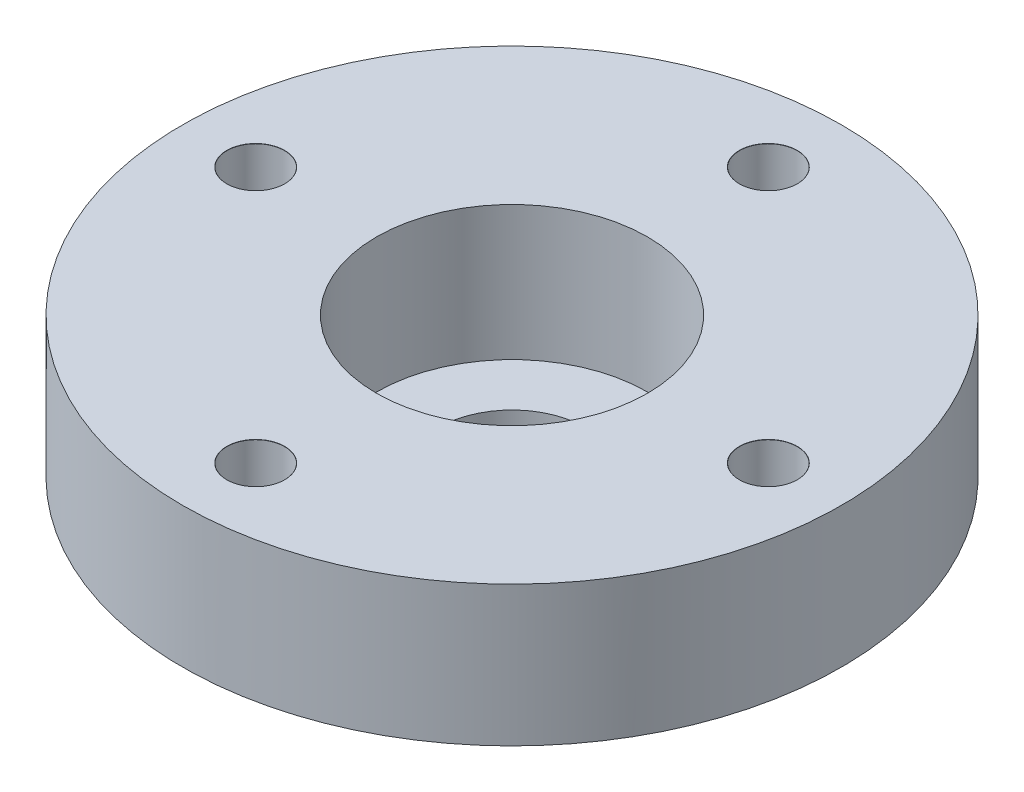
ISO-10303-21;
HEADER;
FILE_DESCRIPTION(('STEP AP214'),'2;1');
FILE_NAME('part.step','',(''),(''),'','','');
FILE_SCHEMA(('AUTOMOTIVE_DESIGN { 1 0 10303 214 1 1 1 1 }'));
ENDSEC;
DATA;
#1=APPLICATION_CONTEXT('core data for automotive mechanical design processes');
#2=APPLICATION_PROTOCOL_DEFINITION('international standard','automotive_design',2000,#1);
#3=PRODUCT_CONTEXT('',#1,'mechanical');
#4=PRODUCT('Part','Part','',(#3));
#5=PRODUCT_RELATED_PRODUCT_CATEGORY('part','',(#4));
#6=PRODUCT_DEFINITION_FORMATION('','',#4);
#7=PRODUCT_DEFINITION_CONTEXT('part definition',#1,'design');
#8=PRODUCT_DEFINITION('design','',#6,#7);
#9=PRODUCT_DEFINITION_SHAPE('','',#8);
#10=(LENGTH_UNIT() NAMED_UNIT(*) SI_UNIT(.MILLI.,.METRE.));
#11=(NAMED_UNIT(*) PLANE_ANGLE_UNIT() SI_UNIT($,.RADIAN.));
#12=(NAMED_UNIT(*) SI_UNIT($,.STERADIAN.) SOLID_ANGLE_UNIT());
#13=UNCERTAINTY_MEASURE_WITH_UNIT(LENGTH_MEASURE(1.E-05),#10,'distance_accuracy_value','');
#14=(GEOMETRIC_REPRESENTATION_CONTEXT(3) GLOBAL_UNCERTAINTY_ASSIGNED_CONTEXT((#13)) GLOBAL_UNIT_ASSIGNED_CONTEXT((#10,
#11,#12)) REPRESENTATION_CONTEXT('',''));
#15=CARTESIAN_POINT('',(0.,0.,0.));
#16=DIRECTION('',(0.,0.,1.));
#17=DIRECTION('',(1.,0.,0.));
#18=AXIS2_PLACEMENT_3D('',#15,#16,#17);
#19=CARTESIAN_POINT('',(0.,-4.,0.));
#20=DIRECTION('',(0.,-1.,0.));
#21=DIRECTION('',(0.,0.,-1.));
#22=AXIS2_PLACEMENT_3D('',#19,#20,#21);
#23=PLANE('',#22);
#24=CARTESIAN_POINT('',(-44.45,-4.,0.));
#25=DIRECTION('',(0.,1.,0.));
#26=DIRECTION('',(0.,0.,1.));
#27=AXIS2_PLACEMENT_3D('',#24,#25,#26);
#28=CIRCLE('',#27,5.025);
#29=CARTESIAN_POINT('',(-44.45,-4.,5.025));
#30=VERTEX_POINT('',#29);
#31=EDGE_CURVE('E112',#30,#30,#28,.T.);
#32=ORIENTED_EDGE('',*,*,#31,.T.);
#33=EDGE_LOOP('',(#32));
#34=FACE_BOUND('',#33,.T.);
#35=CARTESIAN_POINT('',(0.,-4.,44.45));
#36=DIRECTION('',(0.,1.,0.));
#37=DIRECTION('',(0.,0.,1.));
#38=AXIS2_PLACEMENT_3D('',#35,#36,#37);
#39=CIRCLE('',#38,5.025);
#40=CARTESIAN_POINT('',(0.,-4.,49.475));
#41=VERTEX_POINT('',#40);
#42=EDGE_CURVE('E100',#41,#41,#39,.T.);
#43=ORIENTED_EDGE('',*,*,#42,.T.);
#44=EDGE_LOOP('',(#43));
#45=FACE_BOUND('',#44,.T.);
#46=CARTESIAN_POINT('',(0.,-4.,-44.45));
#47=DIRECTION('',(0.,1.,0.));
#48=DIRECTION('',(0.,0.,1.));
#49=AXIS2_PLACEMENT_3D('',#46,#47,#48);
#50=CIRCLE('',#49,5.025);
#51=CARTESIAN_POINT('',(0.,-4.,-39.425));
#52=VERTEX_POINT('',#51);
#53=EDGE_CURVE('E88',#52,#52,#50,.T.);
#54=ORIENTED_EDGE('',*,*,#53,.T.);
#55=EDGE_LOOP('',(#54));
#56=FACE_BOUND('',#55,.T.);
#57=CARTESIAN_POINT('',(44.45,-4.,0.));
#58=DIRECTION('',(0.,1.,0.));
#59=DIRECTION('',(0.,0.,1.));
#60=AXIS2_PLACEMENT_3D('',#57,#58,#59);
#61=CIRCLE('',#60,5.025);
#62=CARTESIAN_POINT('',(44.45,-4.,5.025));
#63=VERTEX_POINT('',#62);
#64=EDGE_CURVE('E76',#63,#63,#61,.T.);
#65=ORIENTED_EDGE('',*,*,#64,.T.);
#66=EDGE_LOOP('',(#65));
#67=FACE_BOUND('',#66,.T.);
#68=CARTESIAN_POINT('',(0.,-4.,0.));
#69=DIRECTION('',(0.,-1.,0.));
#70=DIRECTION('',(0.,0.,-1.));
#71=AXIS2_PLACEMENT_3D('',#68,#69,#70);
#72=CIRCLE('',#71,57.15);
#73=CARTESIAN_POINT('',(0.,-4.,-57.15));
#74=VERTEX_POINT('',#73);
#75=EDGE_CURVE('E42',#74,#74,#72,.T.);
#76=ORIENTED_EDGE('',*,*,#75,.T.);
#77=EDGE_LOOP('',(#76));
#78=FACE_BOUND('',#77,.T.);
#79=CARTESIAN_POINT('',(0.,-4.,0.));
#80=DIRECTION('',(0.,-1.,0.));
#81=DIRECTION('',(0.,0.,-1.));
#82=AXIS2_PLACEMENT_3D('',#79,#80,#81);
#83=CIRCLE('',#82,15.);
#84=CARTESIAN_POINT('',(0.,-4.,-15.));
#85=VERTEX_POINT('',#84);
#86=EDGE_CURVE('E53',#85,#85,#83,.T.);
#87=ORIENTED_EDGE('',*,*,#86,.F.);
#88=EDGE_LOOP('',(#87));
#89=FACE_BOUND('',#88,.T.);
#90=ADVANCED_FACE('F35',(#34,#45,#56,#67,#78,#89),#23,.T.);
#91=CARTESIAN_POINT('',(0.,175.644610179245,0.));
#92=DIRECTION('',(0.,-1.,0.));
#93=DIRECTION('',(0.,0.,-1.));
#94=AXIS2_PLACEMENT_3D('',#91,#92,#93);
#95=CYLINDRICAL_SURFACE('',#94,57.15);
#96=ORIENTED_EDGE('',*,*,#75,.F.);
#97=EDGE_LOOP('',(#96));
#98=FACE_BOUND('',#97,.T.);
#99=CARTESIAN_POINT('',(0.,20.3,0.));
#100=DIRECTION('',(0.,1.,0.));
#101=DIRECTION('',(0.,0.,1.));
#102=AXIS2_PLACEMENT_3D('',#99,#100,#101);
#103=CIRCLE('',#102,57.15);
#104=CARTESIAN_POINT('',(0.,20.3,57.15));
#105=VERTEX_POINT('',#104);
#106=EDGE_CURVE('E61',#105,#105,#103,.T.);
#107=ORIENTED_EDGE('',*,*,#106,.F.);
#108=EDGE_LOOP('',(#107));
#109=FACE_BOUND('',#108,.T.);
#110=ADVANCED_FACE('F37',(#98,#109),#95,.T.);
#111=CARTESIAN_POINT('',(0.,80.4680374315355,0.));
#112=DIRECTION('',(0.,-1.,0.));
#113=DIRECTION('',(0.,0.,-1.));
#114=AXIS2_PLACEMENT_3D('',#111,#112,#113);
#115=CYLINDRICAL_SURFACE('',#114,23.5);
#116=CARTESIAN_POINT('',(0.,-3.,0.));
#117=DIRECTION('',(0.,-1.,0.));
#118=DIRECTION('',(0.,0.,-1.));
#119=AXIS2_PLACEMENT_3D('',#116,#117,#118);
#120=CIRCLE('',#119,23.5);
#121=CARTESIAN_POINT('',(0.,-3.,-23.5));
#122=VERTEX_POINT('',#121);
#123=EDGE_CURVE('E10',#122,#122,#120,.F.);
#124=ORIENTED_EDGE('',*,*,#123,.F.);
#125=EDGE_LOOP('',(#124));
#126=FACE_BOUND('',#125,.T.);
#127=CARTESIAN_POINT('',(0.,20.3,0.));
#128=DIRECTION('',(0.,1.,0.));
#129=DIRECTION('',(0.,0.,1.));
#130=AXIS2_PLACEMENT_3D('',#127,#128,#129);
#131=CIRCLE('',#130,23.5);
#132=CARTESIAN_POINT('',(0.,20.3,23.5));
#133=VERTEX_POINT('',#132);
#134=EDGE_CURVE('E64',#133,#133,#131,.T.);
#135=ORIENTED_EDGE('',*,*,#134,.T.);
#136=EDGE_LOOP('',(#135));
#137=FACE_BOUND('',#136,.T.);
#138=ADVANCED_FACE('F153',(#126,#137),#115,.F.);
#139=CARTESIAN_POINT('',(0.,-3.,0.));
#140=DIRECTION('',(0.,-1.,0.));
#141=DIRECTION('',(0.,0.,-1.));
#142=AXIS2_PLACEMENT_3D('',#139,#140,#141);
#143=PLANE('',#142);
#144=CARTESIAN_POINT('',(0.,-3.,0.));
#145=DIRECTION('',(0.,-1.,0.));
#146=DIRECTION('',(0.,0.,-1.));
#147=AXIS2_PLACEMENT_3D('',#144,#145,#146);
#148=CIRCLE('',#147,12.8);
#149=CARTESIAN_POINT('',(0.,-3.,-12.8));
#150=VERTEX_POINT('',#149);
#151=EDGE_CURVE('E46',#150,#150,#148,.T.);
#152=ORIENTED_EDGE('',*,*,#151,.T.);
#153=EDGE_LOOP('',(#152));
#154=FACE_BOUND('',#153,.T.);
#155=ORIENTED_EDGE('',*,*,#123,.T.);
#156=EDGE_LOOP('',(#155));
#157=FACE_BOUND('',#156,.T.);
#158=ADVANCED_FACE('F155',(#154,#157),#143,.F.);
#159=CARTESIAN_POINT('',(0.,-4.,0.));
#160=DIRECTION('',(0.,1.,0.));
#161=DIRECTION('',(0.,0.,1.));
#162=AXIS2_PLACEMENT_3D('',#159,#160,#161);
#163=CYLINDRICAL_SURFACE('',#162,12.8);
#164=ORIENTED_EDGE('',*,*,#151,.F.);
#165=EDGE_LOOP('',(#164));
#166=FACE_BOUND('',#165,.T.);
#167=CARTESIAN_POINT('',(0.,-6.,0.));
#168=DIRECTION('',(0.,-1.,0.));
#169=DIRECTION('',(0.,0.,-1.));
#170=AXIS2_PLACEMENT_3D('',#167,#168,#169);
#171=CIRCLE('',#170,12.8);
#172=CARTESIAN_POINT('',(0.,-6.,-12.8));
#173=VERTEX_POINT('',#172);
#174=EDGE_CURVE('E56',#173,#173,#171,.T.);
#175=ORIENTED_EDGE('',*,*,#174,.T.);
#176=EDGE_LOOP('',(#175));
#177=FACE_BOUND('',#176,.T.);
#178=ADVANCED_FACE('F161',(#166,#177),#163,.F.);
#179=CARTESIAN_POINT('',(0.,-6.,0.));
#180=DIRECTION('',(0.,-1.,0.));
#181=DIRECTION('',(0.,0.,-1.));
#182=AXIS2_PLACEMENT_3D('',#179,#180,#181);
#183=PLANE('',#182);
#184=CARTESIAN_POINT('',(0.,-6.,0.));
#185=DIRECTION('',(0.,-1.,0.));
#186=DIRECTION('',(0.,0.,-1.));
#187=AXIS2_PLACEMENT_3D('',#184,#185,#186);
#188=CIRCLE('',#187,15.);
#189=CARTESIAN_POINT('',(0.,-6.,-15.));
#190=VERTEX_POINT('',#189);
#191=EDGE_CURVE('E50',#190,#190,#188,.T.);
#192=ORIENTED_EDGE('',*,*,#191,.T.);
#193=EDGE_LOOP('',(#192));
#194=FACE_BOUND('',#193,.T.);
#195=ORIENTED_EDGE('',*,*,#174,.F.);
#196=EDGE_LOOP('',(#195));
#197=FACE_BOUND('',#196,.T.);
#198=ADVANCED_FACE('F172',(#194,#197),#183,.T.);
#199=CARTESIAN_POINT('',(0.,-6.,0.));
#200=DIRECTION('',(0.,1.,0.));
#201=DIRECTION('',(0.,0.,1.));
#202=AXIS2_PLACEMENT_3D('',#199,#200,#201);
#203=CYLINDRICAL_SURFACE('',#202,15.);
#204=ORIENTED_EDGE('',*,*,#191,.F.);
#205=EDGE_LOOP('',(#204));
#206=FACE_BOUND('',#205,.T.);
#207=ORIENTED_EDGE('',*,*,#86,.T.);
#208=EDGE_LOOP('',(#207));
#209=FACE_BOUND('',#208,.T.);
#210=ADVANCED_FACE('F141',(#206,#209),#203,.T.);
#211=CARTESIAN_POINT('',(0.,20.3,0.));
#212=DIRECTION('',(0.,1.,0.));
#213=DIRECTION('',(0.,0.,1.));
#214=AXIS2_PLACEMENT_3D('',#211,#212,#213);
#215=PLANE('',#214);
#216=CARTESIAN_POINT('',(-44.45,20.3,0.));
#217=DIRECTION('',(0.,1.,0.));
#218=DIRECTION('',(0.,0.,1.));
#219=AXIS2_PLACEMENT_3D('',#216,#217,#218);
#220=CIRCLE('',#219,5.025);
#221=CARTESIAN_POINT('',(-44.45,20.3,5.025));
#222=VERTEX_POINT('',#221);
#223=EDGE_CURVE('E109',#222,#222,#220,.T.);
#224=ORIENTED_EDGE('',*,*,#223,.F.);
#225=EDGE_LOOP('',(#224));
#226=FACE_BOUND('',#225,.T.);
#227=CARTESIAN_POINT('',(0.,20.3,44.45));
#228=DIRECTION('',(0.,1.,0.));
#229=DIRECTION('',(0.,0.,1.));
#230=AXIS2_PLACEMENT_3D('',#227,#228,#229);
#231=CIRCLE('',#230,5.025);
#232=CARTESIAN_POINT('',(0.,20.3,49.475));
#233=VERTEX_POINT('',#232);
#234=EDGE_CURVE('E97',#233,#233,#231,.T.);
#235=ORIENTED_EDGE('',*,*,#234,.F.);
#236=EDGE_LOOP('',(#235));
#237=FACE_BOUND('',#236,.T.);
#238=CARTESIAN_POINT('',(0.,20.3,-44.45));
#239=DIRECTION('',(0.,1.,0.));
#240=DIRECTION('',(0.,0.,1.));
#241=AXIS2_PLACEMENT_3D('',#238,#239,#240);
#242=CIRCLE('',#241,5.025);
#243=CARTESIAN_POINT('',(0.,20.3,-39.425));
#244=VERTEX_POINT('',#243);
#245=EDGE_CURVE('E85',#244,#244,#242,.T.);
#246=ORIENTED_EDGE('',*,*,#245,.F.);
#247=EDGE_LOOP('',(#246));
#248=FACE_BOUND('',#247,.T.);
#249=CARTESIAN_POINT('',(44.45,20.3,0.));
#250=DIRECTION('',(0.,1.,0.));
#251=DIRECTION('',(0.,0.,1.));
#252=AXIS2_PLACEMENT_3D('',#249,#250,#251);
#253=CIRCLE('',#252,5.025);
#254=CARTESIAN_POINT('',(44.45,20.3,5.025));
#255=VERTEX_POINT('',#254);
#256=EDGE_CURVE('E73',#255,#255,#253,.T.);
#257=ORIENTED_EDGE('',*,*,#256,.F.);
#258=EDGE_LOOP('',(#257));
#259=FACE_BOUND('',#258,.T.);
#260=ORIENTED_EDGE('',*,*,#106,.T.);
#261=EDGE_LOOP('',(#260));
#262=FACE_BOUND('',#261,.T.);
#263=ORIENTED_EDGE('',*,*,#134,.F.);
#264=EDGE_LOOP('',(#263));
#265=FACE_BOUND('',#264,.T.);
#266=ADVANCED_FACE('F137',(#226,#237,#248,#259,#262,#265),#215,.T.);
#267=CARTESIAN_POINT('',(44.45,-3.975,0.));
#268=DIRECTION('',(0.,-1.,0.));
#269=DIRECTION('',(0.,0.,-1.));
#270=AXIS2_PLACEMENT_3D('',#267,#268,#269);
#271=CONICAL_SURFACE('',#270,5.,0.785398163397309);
#272=ORIENTED_EDGE('',*,*,#64,.F.);
#273=EDGE_LOOP('',(#272));
#274=FACE_BOUND('',#273,.T.);
#275=CARTESIAN_POINT('',(44.45,-3.975,0.));
#276=DIRECTION('',(0.,1.,0.));
#277=DIRECTION('',(0.,0.,1.));
#278=AXIS2_PLACEMENT_3D('',#275,#276,#277);
#279=CIRCLE('',#278,5.);
#280=CARTESIAN_POINT('',(44.45,-3.975,5.));
#281=VERTEX_POINT('',#280);
#282=EDGE_CURVE('E67',#281,#281,#279,.T.);
#283=ORIENTED_EDGE('',*,*,#282,.T.);
#284=EDGE_LOOP('',(#283));
#285=FACE_BOUND('',#284,.T.);
#286=ADVANCED_FACE('F140',(#274,#285),#271,.F.);
#287=CARTESIAN_POINT('',(44.45,20.3,0.));
#288=DIRECTION('',(0.,1.,0.));
#289=DIRECTION('',(0.,0.,1.));
#290=AXIS2_PLACEMENT_3D('',#287,#288,#289);
#291=CYLINDRICAL_SURFACE('',#290,5.);
#292=ORIENTED_EDGE('',*,*,#282,.F.);
#293=EDGE_LOOP('',(#292));
#294=FACE_BOUND('',#293,.T.);
#295=CARTESIAN_POINT('',(44.45,20.275,0.));
#296=DIRECTION('',(0.,1.,0.));
#297=DIRECTION('',(0.,0.,1.));
#298=AXIS2_PLACEMENT_3D('',#295,#296,#297);
#299=CIRCLE('',#298,5.);
#300=CARTESIAN_POINT('',(44.45,20.275,5.));
#301=VERTEX_POINT('',#300);
#302=EDGE_CURVE('E70',#301,#301,#299,.T.);
#303=ORIENTED_EDGE('',*,*,#302,.T.);
#304=EDGE_LOOP('',(#303));
#305=FACE_BOUND('',#304,.T.);
#306=ADVANCED_FACE('F182',(#294,#305),#291,.F.);
#307=CARTESIAN_POINT('',(44.45,20.3,0.));
#308=DIRECTION('',(0.,1.,0.));
#309=DIRECTION('',(0.,0.,1.));
#310=AXIS2_PLACEMENT_3D('',#307,#308,#309);
#311=CONICAL_SURFACE('',#310,5.025,0.785398163397379);
#312=ORIENTED_EDGE('',*,*,#302,.F.);
#313=EDGE_LOOP('',(#312));
#314=FACE_BOUND('',#313,.T.);
#315=ORIENTED_EDGE('',*,*,#256,.T.);
#316=EDGE_LOOP('',(#315));
#317=FACE_BOUND('',#316,.T.);
#318=ADVANCED_FACE('F186',(#314,#317),#311,.F.);
#319=CARTESIAN_POINT('',(0.,-3.975,-44.45));
#320=DIRECTION('',(0.,-1.,0.));
#321=DIRECTION('',(0.,0.,-1.));
#322=AXIS2_PLACEMENT_3D('',#319,#320,#321);
#323=CONICAL_SURFACE('',#322,4.99999999999999,0.785398163397362);
#324=ORIENTED_EDGE('',*,*,#53,.F.);
#325=EDGE_LOOP('',(#324));
#326=FACE_BOUND('',#325,.T.);
#327=CARTESIAN_POINT('',(0.,-3.975,-44.45));
#328=DIRECTION('',(0.,1.,0.));
#329=DIRECTION('',(0.,0.,1.));
#330=AXIS2_PLACEMENT_3D('',#327,#328,#329);
#331=CIRCLE('',#330,4.99999999999999);
#332=CARTESIAN_POINT('',(0.,-3.975,-39.45));
#333=VERTEX_POINT('',#332);
#334=EDGE_CURVE('E79',#333,#333,#331,.T.);
#335=ORIENTED_EDGE('',*,*,#334,.T.);
#336=EDGE_LOOP('',(#335));
#337=FACE_BOUND('',#336,.T.);
#338=ADVANCED_FACE('F190',(#326,#337),#323,.F.);
#339=CARTESIAN_POINT('',(0.,20.3,-44.45));
#340=DIRECTION('',(0.,1.,0.));
#341=DIRECTION('',(0.,0.,1.));
#342=AXIS2_PLACEMENT_3D('',#339,#340,#341);
#343=CYLINDRICAL_SURFACE('',#342,5.);
#344=ORIENTED_EDGE('',*,*,#334,.F.);
#345=EDGE_LOOP('',(#344));
#346=FACE_BOUND('',#345,.T.);
#347=CARTESIAN_POINT('',(0.,20.275,-44.45));
#348=DIRECTION('',(0.,1.,0.));
#349=DIRECTION('',(0.,0.,1.));
#350=AXIS2_PLACEMENT_3D('',#347,#348,#349);
#351=CIRCLE('',#350,5.);
#352=CARTESIAN_POINT('',(0.,20.275,-39.45));
#353=VERTEX_POINT('',#352);
#354=EDGE_CURVE('E82',#353,#353,#351,.T.);
#355=ORIENTED_EDGE('',*,*,#354,.T.);
#356=EDGE_LOOP('',(#355));
#357=FACE_BOUND('',#356,.T.);
#358=ADVANCED_FACE('F194',(#346,#357),#343,.F.);
#359=CARTESIAN_POINT('',(0.,20.3,-44.45));
#360=DIRECTION('',(0.,1.,0.));
#361=DIRECTION('',(0.,0.,1.));
#362=AXIS2_PLACEMENT_3D('',#359,#360,#361);
#363=CONICAL_SURFACE('',#362,5.025,0.785398163397362);
#364=ORIENTED_EDGE('',*,*,#354,.F.);
#365=EDGE_LOOP('',(#364));
#366=FACE_BOUND('',#365,.T.);
#367=ORIENTED_EDGE('',*,*,#245,.T.);
#368=EDGE_LOOP('',(#367));
#369=FACE_BOUND('',#368,.T.);
#370=ADVANCED_FACE('F198',(#366,#369),#363,.F.);
#371=CARTESIAN_POINT('',(0.,-3.975,44.45));
#372=DIRECTION('',(0.,-1.,0.));
#373=DIRECTION('',(0.,0.,-1.));
#374=AXIS2_PLACEMENT_3D('',#371,#372,#373);
#375=CONICAL_SURFACE('',#374,4.99999999999999,0.785398163397362);
#376=ORIENTED_EDGE('',*,*,#42,.F.);
#377=EDGE_LOOP('',(#376));
#378=FACE_BOUND('',#377,.T.);
#379=CARTESIAN_POINT('',(0.,-3.975,44.45));
#380=DIRECTION('',(0.,1.,0.));
#381=DIRECTION('',(0.,0.,1.));
#382=AXIS2_PLACEMENT_3D('',#379,#380,#381);
#383=CIRCLE('',#382,4.99999999999999);
#384=CARTESIAN_POINT('',(0.,-3.975,49.45));
#385=VERTEX_POINT('',#384);
#386=EDGE_CURVE('E91',#385,#385,#383,.T.);
#387=ORIENTED_EDGE('',*,*,#386,.T.);
#388=EDGE_LOOP('',(#387));
#389=FACE_BOUND('',#388,.T.);
#390=ADVANCED_FACE('F202',(#378,#389),#375,.F.);
#391=CARTESIAN_POINT('',(0.,20.3,44.45));
#392=DIRECTION('',(0.,1.,0.));
#393=DIRECTION('',(0.,0.,1.));
#394=AXIS2_PLACEMENT_3D('',#391,#392,#393);
#395=CYLINDRICAL_SURFACE('',#394,5.);
#396=ORIENTED_EDGE('',*,*,#386,.F.);
#397=EDGE_LOOP('',(#396));
#398=FACE_BOUND('',#397,.T.);
#399=CARTESIAN_POINT('',(0.,20.275,44.45));
#400=DIRECTION('',(0.,1.,0.));
#401=DIRECTION('',(0.,0.,1.));
#402=AXIS2_PLACEMENT_3D('',#399,#400,#401);
#403=CIRCLE('',#402,5.);
#404=CARTESIAN_POINT('',(0.,20.275,49.45));
#405=VERTEX_POINT('',#404);
#406=EDGE_CURVE('E94',#405,#405,#403,.T.);
#407=ORIENTED_EDGE('',*,*,#406,.T.);
#408=EDGE_LOOP('',(#407));
#409=FACE_BOUND('',#408,.T.);
#410=ADVANCED_FACE('F206',(#398,#409),#395,.F.);
#411=CARTESIAN_POINT('',(0.,20.3,44.45));
#412=DIRECTION('',(0.,1.,0.));
#413=DIRECTION('',(0.,0.,1.));
#414=AXIS2_PLACEMENT_3D('',#411,#412,#413);
#415=CONICAL_SURFACE('',#414,5.025,0.785398163397362);
#416=ORIENTED_EDGE('',*,*,#406,.F.);
#417=EDGE_LOOP('',(#416));
#418=FACE_BOUND('',#417,.T.);
#419=ORIENTED_EDGE('',*,*,#234,.T.);
#420=EDGE_LOOP('',(#419));
#421=FACE_BOUND('',#420,.T.);
#422=ADVANCED_FACE('F122',(#418,#421),#415,.F.);
#423=CARTESIAN_POINT('',(-44.45,-3.975,0.));
#424=DIRECTION('',(0.,-1.,0.));
#425=DIRECTION('',(0.,0.,-1.));
#426=AXIS2_PLACEMENT_3D('',#423,#424,#425);
#427=CONICAL_SURFACE('',#426,5.,0.785398163397309);
#428=ORIENTED_EDGE('',*,*,#31,.F.);
#429=EDGE_LOOP('',(#428));
#430=FACE_BOUND('',#429,.T.);
#431=CARTESIAN_POINT('',(-44.45,-3.975,0.));
#432=DIRECTION('',(0.,1.,0.));
#433=DIRECTION('',(0.,0.,1.));
#434=AXIS2_PLACEMENT_3D('',#431,#432,#433);
#435=CIRCLE('',#434,5.);
#436=CARTESIAN_POINT('',(-44.45,-3.975,5.));
#437=VERTEX_POINT('',#436);
#438=EDGE_CURVE('E103',#437,#437,#435,.T.);
#439=ORIENTED_EDGE('',*,*,#438,.T.);
#440=EDGE_LOOP('',(#439));
#441=FACE_BOUND('',#440,.T.);
#442=ADVANCED_FACE('F118',(#430,#441),#427,.F.);
#443=CARTESIAN_POINT('',(-44.45,20.3,0.));
#444=DIRECTION('',(0.,1.,0.));
#445=DIRECTION('',(0.,0.,1.));
#446=AXIS2_PLACEMENT_3D('',#443,#444,#445);
#447=CYLINDRICAL_SURFACE('',#446,5.);
#448=ORIENTED_EDGE('',*,*,#438,.F.);
#449=EDGE_LOOP('',(#448));
#450=FACE_BOUND('',#449,.T.);
#451=CARTESIAN_POINT('',(-44.45,20.275,0.));
#452=DIRECTION('',(0.,1.,0.));
#453=DIRECTION('',(0.,0.,1.));
#454=AXIS2_PLACEMENT_3D('',#451,#452,#453);
#455=CIRCLE('',#454,5.);
#456=CARTESIAN_POINT('',(-44.45,20.275,5.));
#457=VERTEX_POINT('',#456);
#458=EDGE_CURVE('E106',#457,#457,#455,.T.);
#459=ORIENTED_EDGE('',*,*,#458,.T.);
#460=EDGE_LOOP('',(#459));
#461=FACE_BOUND('',#460,.T.);
#462=ADVANCED_FACE('F121',(#450,#461),#447,.F.);
#463=CARTESIAN_POINT('',(-44.45,20.3,0.));
#464=DIRECTION('',(0.,1.,0.));
#465=DIRECTION('',(0.,0.,1.));
#466=AXIS2_PLACEMENT_3D('',#463,#464,#465);
#467=CONICAL_SURFACE('',#466,5.025,0.785398163397379);
#468=ORIENTED_EDGE('',*,*,#458,.F.);
#469=EDGE_LOOP('',(#468));
#470=FACE_BOUND('',#469,.T.);
#471=ORIENTED_EDGE('',*,*,#223,.T.);
#472=EDGE_LOOP('',(#471));
#473=FACE_BOUND('',#472,.T.);
#474=ADVANCED_FACE('F128',(#470,#473),#467,.F.);
#475=CLOSED_SHELL('',(#90,#110,#138,#158,#178,#198,#210,#266,#286,#306,#318,#338,#358,#370,#390,
#410,#422,#442,#462,#474));
#476=MANIFOLD_SOLID_BREP('B2',#475);
#477=ADVANCED_BREP_SHAPE_REPRESENTATION('',(#18,#476),#14);
#478=SHAPE_DEFINITION_REPRESENTATION(#9,#477);
ENDSEC;
END-ISO-10303-21;
